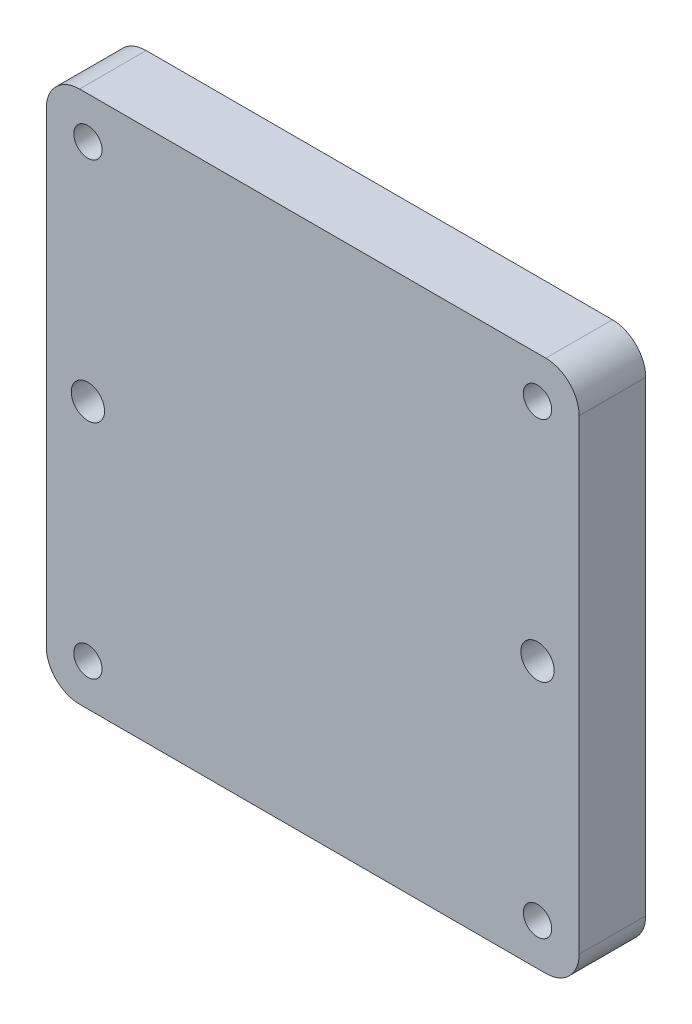
ISO-10303-21;
HEADER;
FILE_DESCRIPTION(('STEP AP214'),'2;1');
FILE_NAME('part.step','',(''),(''),'','','');
FILE_SCHEMA(('AUTOMOTIVE_DESIGN { 1 0 10303 214 1 1 1 1 }'));
ENDSEC;
DATA;
#1=APPLICATION_CONTEXT('core data for automotive mechanical design processes');
#2=APPLICATION_PROTOCOL_DEFINITION('international standard','automotive_design',2000,#1);
#3=PRODUCT_CONTEXT('',#1,'mechanical');
#4=PRODUCT('Part','Part','',(#3));
#5=PRODUCT_RELATED_PRODUCT_CATEGORY('part','',(#4));
#6=PRODUCT_DEFINITION_FORMATION('','',#4);
#7=PRODUCT_DEFINITION_CONTEXT('part definition',#1,'design');
#8=PRODUCT_DEFINITION('design','',#6,#7);
#9=PRODUCT_DEFINITION_SHAPE('','',#8);
#10=(LENGTH_UNIT() NAMED_UNIT(*) SI_UNIT(.MILLI.,.METRE.));
#11=(NAMED_UNIT(*) PLANE_ANGLE_UNIT() SI_UNIT($,.RADIAN.));
#12=(NAMED_UNIT(*) SI_UNIT($,.STERADIAN.) SOLID_ANGLE_UNIT());
#13=UNCERTAINTY_MEASURE_WITH_UNIT(LENGTH_MEASURE(1.E-05),#10,'distance_accuracy_value','');
#14=(GEOMETRIC_REPRESENTATION_CONTEXT(3) GLOBAL_UNCERTAINTY_ASSIGNED_CONTEXT((#13)) GLOBAL_UNIT_ASSIGNED_CONTEXT((#10,
#11,#12)) REPRESENTATION_CONTEXT('',''));
#15=CARTESIAN_POINT('',(0.,0.,0.));
#16=DIRECTION('',(0.,0.,1.));
#17=DIRECTION('',(1.,0.,0.));
#18=AXIS2_PLACEMENT_3D('',#15,#16,#17);
#19=CARTESIAN_POINT('',(44.45,44.45,101.6));
#20=DIRECTION('',(0.,0.,1.));
#21=DIRECTION('',(1.,0.,0.));
#22=AXIS2_PLACEMENT_3D('',#19,#20,#21);
#23=CYLINDRICAL_SURFACE('',#22,6.34999999999999);
#24=CARTESIAN_POINT('',(44.45,44.45,114.3));
#25=DIRECTION('',(0.,0.,1.));
#26=DIRECTION('',(1.,0.,0.));
#27=AXIS2_PLACEMENT_3D('',#24,#25,#26);
#28=CIRCLE('',#27,6.34999999999999);
#29=CARTESIAN_POINT('',(50.8,44.45,114.3));
#30=VERTEX_POINT('',#29);
#31=CARTESIAN_POINT('',(44.4499999999999,50.8,114.3));
#32=VERTEX_POINT('',#31);
#33=EDGE_CURVE('E136',#30,#32,#28,.T.);
#34=ORIENTED_EDGE('',*,*,#33,.F.);
#35=DIRECTION('',(0.,0.,1.));
#36=VECTOR('',#35,1.);
#37=CARTESIAN_POINT('',(50.8,44.45,101.6));
#38=LINE('',#37,#36);
#39=CARTESIAN_POINT('',(50.8,44.45,101.6));
#40=VERTEX_POINT('',#39);
#41=EDGE_CURVE('E11',#40,#30,#38,.T.);
#42=ORIENTED_EDGE('',*,*,#41,.F.);
#43=CARTESIAN_POINT('',(44.45,44.45,101.6));
#44=DIRECTION('',(0.,0.,1.));
#45=DIRECTION('',(1.,0.,0.));
#46=AXIS2_PLACEMENT_3D('',#43,#44,#45);
#47=CIRCLE('',#46,6.34999999999999);
#48=CARTESIAN_POINT('',(44.4499999999999,50.8,101.6));
#49=VERTEX_POINT('',#48);
#50=EDGE_CURVE('E157',#40,#49,#47,.T.);
#51=ORIENTED_EDGE('',*,*,#50,.T.);
#52=DIRECTION('',(0.,0.,1.));
#53=VECTOR('',#52,1.);
#54=CARTESIAN_POINT('',(44.4499999999999,50.8,101.6));
#55=LINE('',#54,#53);
#56=EDGE_CURVE('E42',#49,#32,#55,.T.);
#57=ORIENTED_EDGE('',*,*,#56,.T.);
#58=EDGE_LOOP('',(#34,#42,#51,#57));
#59=FACE_BOUND('',#58,.T.);
#60=ADVANCED_FACE('F39',(#59),#23,.T.);
#61=CARTESIAN_POINT('',(50.8,44.45,101.6));
#62=DIRECTION('',(1.,0.,0.));
#63=DIRECTION('',(0.,1.,0.));
#64=AXIS2_PLACEMENT_3D('',#61,#62,#63);
#65=PLANE('',#64);
#66=DIRECTION('',(0.,1.,0.));
#67=VECTOR('',#66,1.);
#68=CARTESIAN_POINT('',(50.8,44.45,114.3));
#69=LINE('',#68,#67);
#70=CARTESIAN_POINT('',(50.8,-44.45,114.3));
#71=VERTEX_POINT('',#70);
#72=EDGE_CURVE('E155',#71,#30,#69,.T.);
#73=ORIENTED_EDGE('',*,*,#72,.F.);
#74=DIRECTION('',(0.,0.,1.));
#75=VECTOR('',#74,1.);
#76=CARTESIAN_POINT('',(50.8,-44.45,101.6));
#77=LINE('',#76,#75);
#78=CARTESIAN_POINT('',(50.8,-44.45,101.6));
#79=VERTEX_POINT('',#78);
#80=EDGE_CURVE('E48',#79,#71,#77,.T.);
#81=ORIENTED_EDGE('',*,*,#80,.F.);
#82=DIRECTION('',(0.,1.,0.));
#83=VECTOR('',#82,1.);
#84=CARTESIAN_POINT('',(50.8,44.45,101.6));
#85=LINE('',#84,#83);
#86=EDGE_CURVE('E126',#79,#40,#85,.T.);
#87=ORIENTED_EDGE('',*,*,#86,.T.);
#88=ORIENTED_EDGE('',*,*,#41,.T.);
#89=EDGE_LOOP('',(#73,#81,#87,#88));
#90=FACE_BOUND('',#89,.T.);
#91=ADVANCED_FACE('F169',(#90),#65,.T.);
#92=CARTESIAN_POINT('',(44.45,-44.45,101.6));
#93=DIRECTION('',(0.,0.,1.));
#94=DIRECTION('',(1.,0.,0.));
#95=AXIS2_PLACEMENT_3D('',#92,#93,#94);
#96=CYLINDRICAL_SURFACE('',#95,6.35);
#97=CARTESIAN_POINT('',(44.45,-44.45,114.3));
#98=DIRECTION('',(0.,0.,1.));
#99=DIRECTION('',(1.,0.,0.));
#100=AXIS2_PLACEMENT_3D('',#97,#98,#99);
#101=CIRCLE('',#100,6.35);
#102=CARTESIAN_POINT('',(44.4499999999999,-50.8,114.3));
#103=VERTEX_POINT('',#102);
#104=EDGE_CURVE('E113',#103,#71,#101,.T.);
#105=ORIENTED_EDGE('',*,*,#104,.F.);
#106=DIRECTION('',(0.,0.,1.));
#107=VECTOR('',#106,1.);
#108=CARTESIAN_POINT('',(44.4499999999999,-50.8,101.6));
#109=LINE('',#108,#107);
#110=CARTESIAN_POINT('',(44.4499999999999,-50.8,101.6));
#111=VERTEX_POINT('',#110);
#112=EDGE_CURVE('E108',#111,#103,#109,.T.);
#113=ORIENTED_EDGE('',*,*,#112,.F.);
#114=CARTESIAN_POINT('',(44.45,-44.45,101.6));
#115=DIRECTION('',(0.,0.,1.));
#116=DIRECTION('',(1.,0.,0.));
#117=AXIS2_PLACEMENT_3D('',#114,#115,#116);
#118=CIRCLE('',#117,6.35);
#119=EDGE_CURVE('E111',#111,#79,#118,.T.);
#120=ORIENTED_EDGE('',*,*,#119,.T.);
#121=ORIENTED_EDGE('',*,*,#80,.T.);
#122=EDGE_LOOP('',(#105,#113,#120,#121));
#123=FACE_BOUND('',#122,.T.);
#124=ADVANCED_FACE('F110',(#123),#96,.T.);
#125=CARTESIAN_POINT('',(44.4499999999999,-50.8,101.6));
#126=DIRECTION('',(0.,-1.,0.));
#127=DIRECTION('',(0.,0.,-1.));
#128=AXIS2_PLACEMENT_3D('',#125,#126,#127);
#129=PLANE('',#128);
#130=DIRECTION('',(1.,0.,0.));
#131=VECTOR('',#130,1.);
#132=CARTESIAN_POINT('',(44.4499999999999,-50.8,114.3));
#133=LINE('',#132,#131);
#134=CARTESIAN_POINT('',(-44.45,-50.8,114.3));
#135=VERTEX_POINT('',#134);
#136=EDGE_CURVE('E152',#135,#103,#133,.T.);
#137=ORIENTED_EDGE('',*,*,#136,.F.);
#138=DIRECTION('',(0.,0.,1.));
#139=VECTOR('',#138,1.);
#140=CARTESIAN_POINT('',(-44.45,-50.8,101.6));
#141=LINE('',#140,#139);
#142=CARTESIAN_POINT('',(-44.45,-50.8,101.6));
#143=VERTEX_POINT('',#142);
#144=EDGE_CURVE('E118',#143,#135,#141,.T.);
#145=ORIENTED_EDGE('',*,*,#144,.F.);
#146=DIRECTION('',(1.,0.,0.));
#147=VECTOR('',#146,1.);
#148=CARTESIAN_POINT('',(44.4499999999999,-50.8,101.6));
#149=LINE('',#148,#147);
#150=EDGE_CURVE('E124',#143,#111,#149,.T.);
#151=ORIENTED_EDGE('',*,*,#150,.T.);
#152=ORIENTED_EDGE('',*,*,#112,.T.);
#153=EDGE_LOOP('',(#137,#145,#151,#152));
#154=FACE_BOUND('',#153,.T.);
#155=ADVANCED_FACE('F128',(#154),#129,.T.);
#156=CARTESIAN_POINT('',(-44.45,-44.45,101.6));
#157=DIRECTION('',(0.,0.,1.));
#158=DIRECTION('',(1.,0.,0.));
#159=AXIS2_PLACEMENT_3D('',#156,#157,#158);
#160=CYLINDRICAL_SURFACE('',#159,6.34999999999999);
#161=CARTESIAN_POINT('',(-44.45,-44.45,114.3));
#162=DIRECTION('',(0.,0.,1.));
#163=DIRECTION('',(1.,0.,0.));
#164=AXIS2_PLACEMENT_3D('',#161,#162,#163);
#165=CIRCLE('',#164,6.34999999999999);
#166=CARTESIAN_POINT('',(-50.8,-44.45,114.3));
#167=VERTEX_POINT('',#166);
#168=EDGE_CURVE('E149',#167,#135,#165,.T.);
#169=ORIENTED_EDGE('',*,*,#168,.F.);
#170=DIRECTION('',(0.,0.,1.));
#171=VECTOR('',#170,1.);
#172=CARTESIAN_POINT('',(-50.8,-44.45,101.6));
#173=LINE('',#172,#171);
#174=CARTESIAN_POINT('',(-50.8,-44.45,101.6));
#175=VERTEX_POINT('',#174);
#176=EDGE_CURVE('E161',#175,#167,#173,.T.);
#177=ORIENTED_EDGE('',*,*,#176,.F.);
#178=CARTESIAN_POINT('',(-44.45,-44.45,101.6));
#179=DIRECTION('',(0.,0.,1.));
#180=DIRECTION('',(1.,0.,0.));
#181=AXIS2_PLACEMENT_3D('',#178,#179,#180);
#182=CIRCLE('',#181,6.34999999999999);
#183=EDGE_CURVE('E129',#175,#143,#182,.T.);
#184=ORIENTED_EDGE('',*,*,#183,.T.);
#185=ORIENTED_EDGE('',*,*,#144,.T.);
#186=EDGE_LOOP('',(#169,#177,#184,#185));
#187=FACE_BOUND('',#186,.T.);
#188=ADVANCED_FACE('F182',(#187),#160,.T.);
#189=CARTESIAN_POINT('',(-50.8,-44.45,101.6));
#190=DIRECTION('',(-1.,0.,0.));
#191=DIRECTION('',(0.,-1.,0.));
#192=AXIS2_PLACEMENT_3D('',#189,#190,#191);
#193=PLANE('',#192);
#194=DIRECTION('',(0.,-1.,0.));
#195=VECTOR('',#194,1.);
#196=CARTESIAN_POINT('',(-50.8,-44.45,114.3));
#197=LINE('',#196,#195);
#198=CARTESIAN_POINT('',(-50.8,44.45,114.3));
#199=VERTEX_POINT('',#198);
#200=EDGE_CURVE('E146',#199,#167,#197,.T.);
#201=ORIENTED_EDGE('',*,*,#200,.F.);
#202=DIRECTION('',(0.,0.,1.));
#203=VECTOR('',#202,1.);
#204=CARTESIAN_POINT('',(-50.8,44.45,101.6));
#205=LINE('',#204,#203);
#206=CARTESIAN_POINT('',(-50.8,44.45,101.6));
#207=VERTEX_POINT('',#206);
#208=EDGE_CURVE('E163',#207,#199,#205,.T.);
#209=ORIENTED_EDGE('',*,*,#208,.F.);
#210=DIRECTION('',(0.,-1.,0.));
#211=VECTOR('',#210,1.);
#212=CARTESIAN_POINT('',(-50.8,-44.45,101.6));
#213=LINE('',#212,#211);
#214=EDGE_CURVE('E131',#207,#175,#213,.T.);
#215=ORIENTED_EDGE('',*,*,#214,.T.);
#216=ORIENTED_EDGE('',*,*,#176,.T.);
#217=EDGE_LOOP('',(#201,#209,#215,#216));
#218=FACE_BOUND('',#217,.T.);
#219=ADVANCED_FACE('F185',(#218),#193,.T.);
#220=CARTESIAN_POINT('',(-44.45,44.45,101.6));
#221=DIRECTION('',(0.,0.,1.));
#222=DIRECTION('',(1.,0.,0.));
#223=AXIS2_PLACEMENT_3D('',#220,#221,#222);
#224=CYLINDRICAL_SURFACE('',#223,6.35);
#225=CARTESIAN_POINT('',(-44.45,44.45,114.3));
#226=DIRECTION('',(0.,0.,1.));
#227=DIRECTION('',(1.,0.,0.));
#228=AXIS2_PLACEMENT_3D('',#225,#226,#227);
#229=CIRCLE('',#228,6.35);
#230=CARTESIAN_POINT('',(-44.45,50.8,114.3));
#231=VERTEX_POINT('',#230);
#232=EDGE_CURVE('E143',#231,#199,#229,.T.);
#233=ORIENTED_EDGE('',*,*,#232,.F.);
#234=DIRECTION('',(0.,0.,1.));
#235=VECTOR('',#234,1.);
#236=CARTESIAN_POINT('',(-44.45,50.8,101.6));
#237=LINE('',#236,#235);
#238=CARTESIAN_POINT('',(-44.45,50.8,101.6));
#239=VERTEX_POINT('',#238);
#240=EDGE_CURVE('E164',#239,#231,#237,.T.);
#241=ORIENTED_EDGE('',*,*,#240,.F.);
#242=CARTESIAN_POINT('',(-44.45,44.45,101.6));
#243=DIRECTION('',(0.,0.,1.));
#244=DIRECTION('',(1.,0.,0.));
#245=AXIS2_PLACEMENT_3D('',#242,#243,#244);
#246=CIRCLE('',#245,6.35);
#247=EDGE_CURVE('E271',#239,#207,#246,.T.);
#248=ORIENTED_EDGE('',*,*,#247,.T.);
#249=ORIENTED_EDGE('',*,*,#208,.T.);
#250=EDGE_LOOP('',(#233,#241,#248,#249));
#251=FACE_BOUND('',#250,.T.);
#252=ADVANCED_FACE('F189',(#251),#224,.T.);
#253=CARTESIAN_POINT('',(-44.45,50.8,101.6));
#254=DIRECTION('',(0.,1.,0.));
#255=DIRECTION('',(0.,0.,1.));
#256=AXIS2_PLACEMENT_3D('',#253,#254,#255);
#257=PLANE('',#256);
#258=DIRECTION('',(-1.,0.,0.));
#259=VECTOR('',#258,1.);
#260=CARTESIAN_POINT('',(-44.45,50.8,114.3));
#261=LINE('',#260,#259);
#262=EDGE_CURVE('E139',#32,#231,#261,.T.);
#263=ORIENTED_EDGE('',*,*,#262,.F.);
#264=ORIENTED_EDGE('',*,*,#56,.F.);
#265=DIRECTION('',(-1.,0.,0.));
#266=VECTOR('',#265,1.);
#267=CARTESIAN_POINT('',(-44.45,50.8,101.6));
#268=LINE('',#267,#266);
#269=EDGE_CURVE('E269',#49,#239,#268,.T.);
#270=ORIENTED_EDGE('',*,*,#269,.T.);
#271=ORIENTED_EDGE('',*,*,#240,.T.);
#272=EDGE_LOOP('',(#263,#264,#270,#271));
#273=FACE_BOUND('',#272,.T.);
#274=ADVANCED_FACE('F166',(#273),#257,.T.);
#275=CARTESIAN_POINT('',(44.45,44.45,101.6));
#276=DIRECTION('',(0.,0.,1.));
#277=DIRECTION('',(1.,0.,0.));
#278=AXIS2_PLACEMENT_3D('',#275,#276,#277);
#279=PLANE('',#278);
#280=CARTESIAN_POINT('',(-42.8625,-42.8625,101.6));
#281=DIRECTION('',(0.,0.,1.));
#282=DIRECTION('',(1.,0.,0.));
#283=AXIS2_PLACEMENT_3D('',#280,#281,#282);
#284=CIRCLE('',#283,2.69875);
#285=CARTESIAN_POINT('',(-40.16375,-42.8625,101.6));
#286=VERTEX_POINT('',#285);
#287=EDGE_CURVE('E232',#286,#286,#284,.T.);
#288=ORIENTED_EDGE('',*,*,#287,.T.);
#289=EDGE_LOOP('',(#288));
#290=FACE_BOUND('',#289,.T.);
#291=CARTESIAN_POINT('',(42.8625,-42.8625,101.6));
#292=DIRECTION('',(0.,0.,1.));
#293=DIRECTION('',(1.,0.,0.));
#294=AXIS2_PLACEMENT_3D('',#291,#292,#293);
#295=CIRCLE('',#294,2.69875);
#296=CARTESIAN_POINT('',(45.56125,-42.8625,101.6));
#297=VERTEX_POINT('',#296);
#298=EDGE_CURVE('E240',#297,#297,#295,.T.);
#299=ORIENTED_EDGE('',*,*,#298,.T.);
#300=EDGE_LOOP('',(#299));
#301=FACE_BOUND('',#300,.T.);
#302=CARTESIAN_POINT('',(42.8625,42.8625,101.6));
#303=DIRECTION('',(0.,0.,1.));
#304=DIRECTION('',(1.,0.,0.));
#305=AXIS2_PLACEMENT_3D('',#302,#303,#304);
#306=CIRCLE('',#305,2.69875);
#307=CARTESIAN_POINT('',(45.56125,42.8625,101.6));
#308=VERTEX_POINT('',#307);
#309=EDGE_CURVE('E246',#308,#308,#306,.T.);
#310=ORIENTED_EDGE('',*,*,#309,.T.);
#311=EDGE_LOOP('',(#310));
#312=FACE_BOUND('',#311,.T.);
#313=CARTESIAN_POINT('',(-42.8625,42.8625,101.6));
#314=DIRECTION('',(0.,0.,1.));
#315=DIRECTION('',(1.,0.,0.));
#316=AXIS2_PLACEMENT_3D('',#313,#314,#315);
#317=CIRCLE('',#316,2.69875);
#318=CARTESIAN_POINT('',(-40.16375,42.8625,101.6));
#319=VERTEX_POINT('',#318);
#320=EDGE_CURVE('E252',#319,#319,#317,.T.);
#321=ORIENTED_EDGE('',*,*,#320,.T.);
#322=EDGE_LOOP('',(#321));
#323=FACE_BOUND('',#322,.T.);
#324=CARTESIAN_POINT('',(-42.8625,0.,101.6));
#325=DIRECTION('',(0.,0.,1.));
#326=DIRECTION('',(1.,0.,0.));
#327=AXIS2_PLACEMENT_3D('',#324,#325,#326);
#328=CIRCLE('',#327,3.175);
#329=CARTESIAN_POINT('',(-39.6875,0.,101.6));
#330=VERTEX_POINT('',#329);
#331=EDGE_CURVE('E258',#330,#330,#328,.T.);
#332=ORIENTED_EDGE('',*,*,#331,.T.);
#333=EDGE_LOOP('',(#332));
#334=FACE_BOUND('',#333,.T.);
#335=CARTESIAN_POINT('',(42.8625,0.,101.6));
#336=DIRECTION('',(0.,0.,1.));
#337=DIRECTION('',(1.,0.,0.));
#338=AXIS2_PLACEMENT_3D('',#335,#336,#337);
#339=CIRCLE('',#338,3.175);
#340=CARTESIAN_POINT('',(46.0375,0.,101.6));
#341=VERTEX_POINT('',#340);
#342=EDGE_CURVE('E140',#341,#341,#339,.T.);
#343=ORIENTED_EDGE('',*,*,#342,.T.);
#344=EDGE_LOOP('',(#343));
#345=FACE_BOUND('',#344,.T.);
#346=ORIENTED_EDGE('',*,*,#50,.F.);
#347=ORIENTED_EDGE('',*,*,#86,.F.);
#348=ORIENTED_EDGE('',*,*,#119,.F.);
#349=ORIENTED_EDGE('',*,*,#150,.F.);
#350=ORIENTED_EDGE('',*,*,#183,.F.);
#351=ORIENTED_EDGE('',*,*,#214,.F.);
#352=ORIENTED_EDGE('',*,*,#247,.F.);
#353=ORIENTED_EDGE('',*,*,#269,.F.);
#354=EDGE_LOOP('',(#346,#347,#348,#349,#350,#351,#352,#353));
#355=FACE_BOUND('',#354,.T.);
#356=ADVANCED_FACE('F122',(#290,#301,#312,#323,#334,#345,#355),#279,.F.);
#357=CARTESIAN_POINT('',(44.45,44.45,114.3));
#358=DIRECTION('',(0.,0.,1.));
#359=DIRECTION('',(1.,0.,0.));
#360=AXIS2_PLACEMENT_3D('',#357,#358,#359);
#361=PLANE('',#360);
#362=CARTESIAN_POINT('',(-42.8625,-42.8625,114.3));
#363=DIRECTION('',(0.,0.,1.));
#364=DIRECTION('',(1.,0.,0.));
#365=AXIS2_PLACEMENT_3D('',#362,#363,#364);
#366=CIRCLE('',#365,2.69875);
#367=CARTESIAN_POINT('',(-40.16375,-42.8625,114.3));
#368=VERTEX_POINT('',#367);
#369=EDGE_CURVE('E235',#368,#368,#366,.T.);
#370=ORIENTED_EDGE('',*,*,#369,.F.);
#371=EDGE_LOOP('',(#370));
#372=FACE_BOUND('',#371,.T.);
#373=CARTESIAN_POINT('',(42.8625,-42.8625,114.3));
#374=DIRECTION('',(0.,0.,1.));
#375=DIRECTION('',(1.,0.,0.));
#376=AXIS2_PLACEMENT_3D('',#373,#374,#375);
#377=CIRCLE('',#376,2.69875);
#378=CARTESIAN_POINT('',(45.56125,-42.8625,114.3));
#379=VERTEX_POINT('',#378);
#380=EDGE_CURVE('E237',#379,#379,#377,.T.);
#381=ORIENTED_EDGE('',*,*,#380,.F.);
#382=EDGE_LOOP('',(#381));
#383=FACE_BOUND('',#382,.T.);
#384=CARTESIAN_POINT('',(42.8625,42.8625,114.3));
#385=DIRECTION('',(0.,0.,1.));
#386=DIRECTION('',(1.,0.,0.));
#387=AXIS2_PLACEMENT_3D('',#384,#385,#386);
#388=CIRCLE('',#387,2.69875);
#389=CARTESIAN_POINT('',(45.56125,42.8625,114.3));
#390=VERTEX_POINT('',#389);
#391=EDGE_CURVE('E243',#390,#390,#388,.T.);
#392=ORIENTED_EDGE('',*,*,#391,.F.);
#393=EDGE_LOOP('',(#392));
#394=FACE_BOUND('',#393,.T.);
#395=CARTESIAN_POINT('',(-42.8625,42.8625,114.3));
#396=DIRECTION('',(0.,0.,1.));
#397=DIRECTION('',(1.,0.,0.));
#398=AXIS2_PLACEMENT_3D('',#395,#396,#397);
#399=CIRCLE('',#398,2.69875);
#400=CARTESIAN_POINT('',(-40.16375,42.8625,114.3));
#401=VERTEX_POINT('',#400);
#402=EDGE_CURVE('E249',#401,#401,#399,.T.);
#403=ORIENTED_EDGE('',*,*,#402,.F.);
#404=EDGE_LOOP('',(#403));
#405=FACE_BOUND('',#404,.T.);
#406=CARTESIAN_POINT('',(-42.8625,0.,114.3));
#407=DIRECTION('',(0.,0.,1.));
#408=DIRECTION('',(1.,0.,0.));
#409=AXIS2_PLACEMENT_3D('',#406,#407,#408);
#410=CIRCLE('',#409,3.175);
#411=CARTESIAN_POINT('',(-39.6875,0.,114.3));
#412=VERTEX_POINT('',#411);
#413=EDGE_CURVE('E255',#412,#412,#410,.T.);
#414=ORIENTED_EDGE('',*,*,#413,.F.);
#415=EDGE_LOOP('',(#414));
#416=FACE_BOUND('',#415,.T.);
#417=CARTESIAN_POINT('',(42.8625,0.,114.3));
#418=DIRECTION('',(0.,0.,1.));
#419=DIRECTION('',(1.,0.,0.));
#420=AXIS2_PLACEMENT_3D('',#417,#418,#419);
#421=CIRCLE('',#420,3.175);
#422=CARTESIAN_POINT('',(46.0375,0.,114.3));
#423=VERTEX_POINT('',#422);
#424=EDGE_CURVE('E261',#423,#423,#421,.T.);
#425=ORIENTED_EDGE('',*,*,#424,.F.);
#426=EDGE_LOOP('',(#425));
#427=FACE_BOUND('',#426,.T.);
#428=ORIENTED_EDGE('',*,*,#33,.T.);
#429=ORIENTED_EDGE('',*,*,#262,.T.);
#430=ORIENTED_EDGE('',*,*,#232,.T.);
#431=ORIENTED_EDGE('',*,*,#200,.T.);
#432=ORIENTED_EDGE('',*,*,#168,.T.);
#433=ORIENTED_EDGE('',*,*,#136,.T.);
#434=ORIENTED_EDGE('',*,*,#104,.T.);
#435=ORIENTED_EDGE('',*,*,#72,.T.);
#436=EDGE_LOOP('',(#428,#429,#430,#431,#432,#433,#434,#435));
#437=FACE_BOUND('',#436,.T.);
#438=ADVANCED_FACE('F168',(#372,#383,#394,#405,#416,#427,#437),#361,.T.);
#439=CARTESIAN_POINT('',(42.8625,0.,101.6));
#440=DIRECTION('',(0.,0.,1.));
#441=DIRECTION('',(1.,0.,0.));
#442=AXIS2_PLACEMENT_3D('',#439,#440,#441);
#443=CYLINDRICAL_SURFACE('',#442,3.175);
#444=ORIENTED_EDGE('',*,*,#342,.F.);
#445=EDGE_LOOP('',(#444));
#446=FACE_BOUND('',#445,.T.);
#447=ORIENTED_EDGE('',*,*,#424,.T.);
#448=EDGE_LOOP('',(#447));
#449=FACE_BOUND('',#448,.T.);
#450=ADVANCED_FACE('F201',(#446,#449),#443,.F.);
#451=CARTESIAN_POINT('',(-42.8625,0.,101.6));
#452=DIRECTION('',(0.,0.,1.));
#453=DIRECTION('',(1.,0.,0.));
#454=AXIS2_PLACEMENT_3D('',#451,#452,#453);
#455=CYLINDRICAL_SURFACE('',#454,3.175);
#456=ORIENTED_EDGE('',*,*,#331,.F.);
#457=EDGE_LOOP('',(#456));
#458=FACE_BOUND('',#457,.T.);
#459=ORIENTED_EDGE('',*,*,#413,.T.);
#460=EDGE_LOOP('',(#459));
#461=FACE_BOUND('',#460,.T.);
#462=ADVANCED_FACE('F208',(#458,#461),#455,.F.);
#463=CARTESIAN_POINT('',(-42.8625,42.8625,101.6));
#464=DIRECTION('',(0.,0.,1.));
#465=DIRECTION('',(1.,0.,0.));
#466=AXIS2_PLACEMENT_3D('',#463,#464,#465);
#467=CYLINDRICAL_SURFACE('',#466,2.69875);
#468=ORIENTED_EDGE('',*,*,#320,.F.);
#469=EDGE_LOOP('',(#468));
#470=FACE_BOUND('',#469,.T.);
#471=ORIENTED_EDGE('',*,*,#402,.T.);
#472=EDGE_LOOP('',(#471));
#473=FACE_BOUND('',#472,.T.);
#474=ADVANCED_FACE('F212',(#470,#473),#467,.F.);
#475=CARTESIAN_POINT('',(42.8625,42.8625,101.6));
#476=DIRECTION('',(0.,0.,1.));
#477=DIRECTION('',(1.,0.,0.));
#478=AXIS2_PLACEMENT_3D('',#475,#476,#477);
#479=CYLINDRICAL_SURFACE('',#478,2.69875);
#480=ORIENTED_EDGE('',*,*,#309,.F.);
#481=EDGE_LOOP('',(#480));
#482=FACE_BOUND('',#481,.T.);
#483=ORIENTED_EDGE('',*,*,#391,.T.);
#484=EDGE_LOOP('',(#483));
#485=FACE_BOUND('',#484,.T.);
#486=ADVANCED_FACE('F216',(#482,#485),#479,.F.);
#487=CARTESIAN_POINT('',(42.8625,-42.8625,101.6));
#488=DIRECTION('',(0.,0.,1.));
#489=DIRECTION('',(1.,0.,0.));
#490=AXIS2_PLACEMENT_3D('',#487,#488,#489);
#491=CYLINDRICAL_SURFACE('',#490,2.69875);
#492=ORIENTED_EDGE('',*,*,#298,.F.);
#493=EDGE_LOOP('',(#492));
#494=FACE_BOUND('',#493,.T.);
#495=ORIENTED_EDGE('',*,*,#380,.T.);
#496=EDGE_LOOP('',(#495));
#497=FACE_BOUND('',#496,.T.);
#498=ADVANCED_FACE('F220',(#494,#497),#491,.F.);
#499=CARTESIAN_POINT('',(-42.8625,-42.8625,101.6));
#500=DIRECTION('',(0.,0.,1.));
#501=DIRECTION('',(1.,0.,0.));
#502=AXIS2_PLACEMENT_3D('',#499,#500,#501);
#503=CYLINDRICAL_SURFACE('',#502,2.69875);
#504=ORIENTED_EDGE('',*,*,#287,.F.);
#505=EDGE_LOOP('',(#504));
#506=FACE_BOUND('',#505,.T.);
#507=ORIENTED_EDGE('',*,*,#369,.T.);
#508=EDGE_LOOP('',(#507));
#509=FACE_BOUND('',#508,.T.);
#510=ADVANCED_FACE('F224',(#506,#509),#503,.F.);
#511=CLOSED_SHELL('',(#60,#91,#124,#155,#188,#219,#252,#274,#356,#438,#450,#462,#474,#486,#498,#510));
#512=MANIFOLD_SOLID_BREP('B2',#511);
#513=ADVANCED_BREP_SHAPE_REPRESENTATION('',(#18,#512),#14);
#514=SHAPE_DEFINITION_REPRESENTATION(#9,#513);
ENDSEC;
END-ISO-10303-21;
